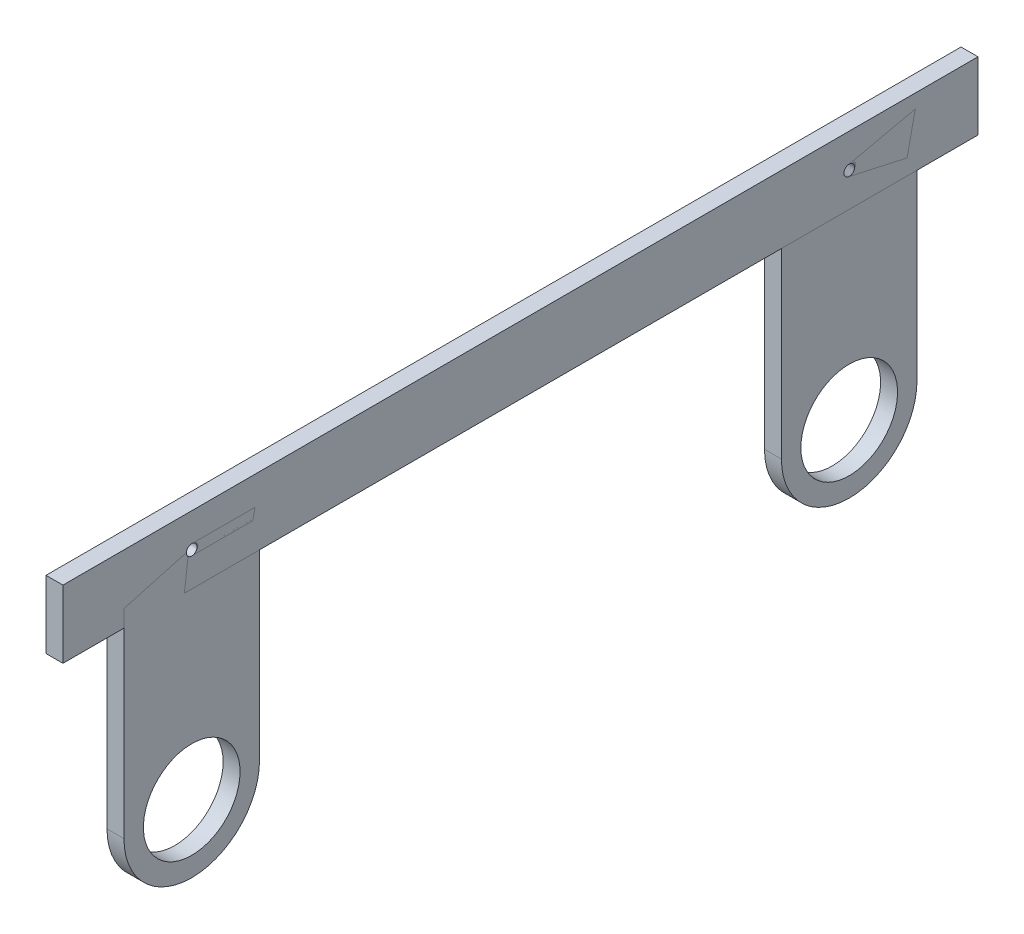
ISO-10303-21;
HEADER;
FILE_DESCRIPTION(('STEP AP214'),'2;1');
FILE_NAME('part.step','',(''),(''),'','','');
FILE_SCHEMA(('AUTOMOTIVE_DESIGN { 1 0 10303 214 1 1 1 1 }'));
ENDSEC;
DATA;
#1=APPLICATION_CONTEXT('core data for automotive mechanical design processes');
#2=APPLICATION_PROTOCOL_DEFINITION('international standard','automotive_design',2000,#1);
#3=PRODUCT_CONTEXT('',#1,'mechanical');
#4=PRODUCT('Part','Part','',(#3));
#5=PRODUCT_RELATED_PRODUCT_CATEGORY('part','',(#4));
#6=PRODUCT_DEFINITION_FORMATION('','',#4);
#7=PRODUCT_DEFINITION_CONTEXT('part definition',#1,'design');
#8=PRODUCT_DEFINITION('design','',#6,#7);
#9=PRODUCT_DEFINITION_SHAPE('','',#8);
#10=(LENGTH_UNIT() NAMED_UNIT(*) SI_UNIT(.MILLI.,.METRE.));
#11=(NAMED_UNIT(*) PLANE_ANGLE_UNIT() SI_UNIT($,.RADIAN.));
#12=(NAMED_UNIT(*) SI_UNIT($,.STERADIAN.) SOLID_ANGLE_UNIT());
#13=UNCERTAINTY_MEASURE_WITH_UNIT(LENGTH_MEASURE(1.E-05),#10,'distance_accuracy_value','');
#14=(GEOMETRIC_REPRESENTATION_CONTEXT(3) GLOBAL_UNCERTAINTY_ASSIGNED_CONTEXT((#13)) GLOBAL_UNIT_ASSIGNED_CONTEXT((#10,
#11,#12)) REPRESENTATION_CONTEXT('',''));
#15=CARTESIAN_POINT('',(0.,0.,0.));
#16=DIRECTION('',(0.,0.,1.));
#17=DIRECTION('',(1.,0.,0.));
#18=AXIS2_PLACEMENT_3D('',#15,#16,#17);
#19=CARTESIAN_POINT('',(-1.5662353927635,-64.1697161622128,97.0000000000001));
#20=DIRECTION('',(1.,0.,0.));
#21=DIRECTION('',(0.,0.,-1.));
#22=AXIS2_PLACEMENT_3D('',#19,#20,#21);
#23=PLANE('',#22);
#24=CARTESIAN_POINT('',(-1.56623539276351,-0.373605612575221,97.0000000000001));
#25=DIRECTION('',(1.,0.,0.));
#26=DIRECTION('',(0.,0.,-1.));
#27=AXIS2_PLACEMENT_3D('',#24,#25,#26);
#28=CIRCLE('',#27,1.58);
#29=CARTESIAN_POINT('',(-1.56623539276351,-0.37360561257522,95.4200000000001));
#30=VERTEX_POINT('',#29);
#31=EDGE_CURVE('P0_E85',#30,#30,#28,.T.);
#32=ORIENTED_EDGE('',*,*,#31,.F.);
#33=EDGE_LOOP('',(#32));
#34=FACE_BOUND('',#33,.T.);
#35=CARTESIAN_POINT('',(-1.5662353927635,-64.1697161622128,97.0000000000001));
#36=DIRECTION('',(1.,0.,0.));
#37=DIRECTION('',(0.,0.,-1.));
#38=AXIS2_PLACEMENT_3D('',#35,#36,#37);
#39=CIRCLE('',#38,20.);
#40=CARTESIAN_POINT('',(-1.5662353927635,-64.1697161622128,117.));
#41=VERTEX_POINT('',#40);
#42=CARTESIAN_POINT('',(-1.5662353927635,-64.1697161622128,77.0000000000001));
#43=VERTEX_POINT('',#42);
#44=EDGE_CURVE('P0_E68',#41,#43,#39,.T.);
#45=ORIENTED_EDGE('',*,*,#44,.T.);
#46=DIRECTION('',(0.,1.,0.));
#47=VECTOR('',#46,1.);
#48=CARTESIAN_POINT('',(-1.56623539276351,7.83028383778716,77.0000000000001));
#49=LINE('',#48,#47);
#50=CARTESIAN_POINT('',(-1.56623539276351,7.83028383778716,77.0000000000001));
#51=VERTEX_POINT('',#50);
#52=EDGE_CURVE('P0_E62',#43,#51,#49,.T.);
#53=ORIENTED_EDGE('',*,*,#52,.T.);
#54=DIRECTION('',(0.,0.,1.));
#55=VECTOR('',#54,1.);
#56=CARTESIAN_POINT('',(-1.56623539276351,7.83028383778716,117.));
#57=LINE('',#56,#55);
#58=CARTESIAN_POINT('',(-1.56623539276351,7.83028383778716,117.));
#59=VERTEX_POINT('',#58);
#60=EDGE_CURVE('P0_E65',#51,#59,#57,.T.);
#61=ORIENTED_EDGE('',*,*,#60,.T.);
#62=DIRECTION('',(0.,-1.,0.));
#63=VECTOR('',#62,1.);
#64=CARTESIAN_POINT('',(-1.56623539276351,7.83028383778716,117.));
#65=LINE('',#64,#63);
#66=EDGE_CURVE('P0_E34',#59,#41,#65,.T.);
#67=ORIENTED_EDGE('',*,*,#66,.T.);
#68=EDGE_LOOP('',(#45,#53,#61,#67));
#69=FACE_BOUND('',#68,.T.);
#70=CARTESIAN_POINT('',(-1.5662353927635,-64.1697161622128,97.0000000000001));
#71=DIRECTION('',(1.,0.,0.));
#72=DIRECTION('',(0.,0.,-1.));
#73=AXIS2_PLACEMENT_3D('',#70,#71,#72);
#74=CIRCLE('',#73,14.26);
#75=CARTESIAN_POINT('',(-1.5662353927635,-64.1697161622128,82.7400000000001));
#76=VERTEX_POINT('',#75);
#77=EDGE_CURVE('P0_E97',#76,#76,#74,.T.);
#78=ORIENTED_EDGE('',*,*,#77,.F.);
#79=EDGE_LOOP('',(#78));
#80=FACE_BOUND('',#79,.T.);
#81=ADVANCED_FACE('P0_F17',(#34,#69,#80),#23,.T.);
#82=CARTESIAN_POINT('',(-6.5662353927635,-64.1697161622128,97.0000000000001));
#83=DIRECTION('',(1.,0.,0.));
#84=DIRECTION('',(0.,0.,-1.));
#85=AXIS2_PLACEMENT_3D('',#82,#83,#84);
#86=PLANE('',#85);
#87=CARTESIAN_POINT('',(-6.5662353927635,-64.1697161622128,97.0000000000001));
#88=DIRECTION('',(1.,0.,0.));
#89=DIRECTION('',(0.,0.,-1.));
#90=AXIS2_PLACEMENT_3D('',#87,#88,#89);
#91=CIRCLE('',#90,20.);
#92=CARTESIAN_POINT('',(-6.5662353927635,-64.1697161622128,117.));
#93=VERTEX_POINT('',#92);
#94=CARTESIAN_POINT('',(-6.5662353927635,-64.1697161622128,77.0000000000001));
#95=VERTEX_POINT('',#94);
#96=EDGE_CURVE('P0_E82',#93,#95,#91,.T.);
#97=ORIENTED_EDGE('',*,*,#96,.F.);
#98=DIRECTION('',(0.,-1.,0.));
#99=VECTOR('',#98,1.);
#100=CARTESIAN_POINT('',(-6.5662353927635,-64.1697161622128,117.));
#101=LINE('',#100,#99);
#102=CARTESIAN_POINT('',(-6.56623539276351,7.83028383778716,117.));
#103=VERTEX_POINT('',#102);
#104=EDGE_CURVE('P0_E51',#103,#93,#101,.T.);
#105=ORIENTED_EDGE('',*,*,#104,.F.);
#106=DIRECTION('',(0.,0.,1.));
#107=VECTOR('',#106,1.);
#108=CARTESIAN_POINT('',(-6.56623539276351,7.83028383778716,117.));
#109=LINE('',#108,#107);
#110=CARTESIAN_POINT('',(-6.56623539276351,7.83028383778716,77.0000000000001));
#111=VERTEX_POINT('',#110);
#112=EDGE_CURVE('P0_E87',#111,#103,#109,.T.);
#113=ORIENTED_EDGE('',*,*,#112,.F.);
#114=DIRECTION('',(0.,1.,0.));
#115=VECTOR('',#114,1.);
#116=CARTESIAN_POINT('',(-6.56623539276351,7.83028383778716,77.0000000000001));
#117=LINE('',#116,#115);
#118=EDGE_CURVE('P0_E73',#95,#111,#117,.T.);
#119=ORIENTED_EDGE('',*,*,#118,.F.);
#120=EDGE_LOOP('',(#97,#105,#113,#119));
#121=FACE_BOUND('',#120,.T.);
#122=CARTESIAN_POINT('',(-6.56623539276351,-0.373605612575222,97.0000000000001));
#123=DIRECTION('',(1.,0.,0.));
#124=DIRECTION('',(0.,0.,-1.));
#125=AXIS2_PLACEMENT_3D('',#122,#123,#124);
#126=CIRCLE('',#125,1.58);
#127=CARTESIAN_POINT('',(-6.56623539276351,-0.373605612575222,95.4200000000001));
#128=VERTEX_POINT('',#127);
#129=EDGE_CURVE('P0_E94',#128,#128,#126,.T.);
#130=ORIENTED_EDGE('',*,*,#129,.T.);
#131=EDGE_LOOP('',(#130));
#132=FACE_BOUND('',#131,.T.);
#133=CARTESIAN_POINT('',(-6.5662353927635,-64.1697161622128,97.0000000000001));
#134=DIRECTION('',(1.,0.,0.));
#135=DIRECTION('',(0.,0.,-1.));
#136=AXIS2_PLACEMENT_3D('',#133,#134,#135);
#137=CIRCLE('',#136,14.26);
#138=CARTESIAN_POINT('',(-6.5662353927635,-64.1697161622128,82.7400000000001));
#139=VERTEX_POINT('',#138);
#140=EDGE_CURVE('P0_E100',#139,#139,#137,.T.);
#141=ORIENTED_EDGE('',*,*,#140,.T.);
#142=EDGE_LOOP('',(#141));
#143=FACE_BOUND('',#142,.T.);
#144=ADVANCED_FACE('P0_F109',(#121,#132,#143),#86,.F.);
#145=CARTESIAN_POINT('',(-1.5662353927635,-64.1697161622128,97.0000000000001));
#146=DIRECTION('',(-1.,0.,0.));
#147=DIRECTION('',(0.,0.,1.));
#148=AXIS2_PLACEMENT_3D('',#145,#146,#147);
#149=CYLINDRICAL_SURFACE('',#148,20.);
#150=ORIENTED_EDGE('',*,*,#96,.T.);
#151=DIRECTION('',(-1.,0.,0.));
#152=VECTOR('',#151,1.);
#153=CARTESIAN_POINT('',(-1.5662353927635,-64.1697161622128,77.0000000000001));
#154=LINE('',#153,#152);
#155=EDGE_CURVE('P0_E11',#43,#95,#154,.T.);
#156=ORIENTED_EDGE('',*,*,#155,.F.);
#157=ORIENTED_EDGE('',*,*,#44,.F.);
#158=DIRECTION('',(-1.,0.,0.));
#159=VECTOR('',#158,1.);
#160=CARTESIAN_POINT('',(-1.5662353927635,-64.1697161622128,117.));
#161=LINE('',#160,#159);
#162=EDGE_CURVE('P0_E78',#41,#93,#161,.T.);
#163=ORIENTED_EDGE('',*,*,#162,.T.);
#164=EDGE_LOOP('',(#150,#156,#157,#163));
#165=FACE_BOUND('',#164,.T.);
#166=ADVANCED_FACE('P0_F19',(#165),#149,.T.);
#167=CARTESIAN_POINT('',(-1.56623539276351,7.83028383778716,77.0000000000001));
#168=DIRECTION('',(0.,0.,1.));
#169=DIRECTION('',(0.,-1.,0.));
#170=AXIS2_PLACEMENT_3D('',#167,#168,#169);
#171=PLANE('',#170);
#172=ORIENTED_EDGE('',*,*,#118,.T.);
#173=DIRECTION('',(-1.,0.,0.));
#174=VECTOR('',#173,1.);
#175=CARTESIAN_POINT('',(-1.56623539276351,7.83028383778716,77.0000000000001));
#176=LINE('',#175,#174);
#177=EDGE_CURVE('P0_E26',#51,#111,#176,.T.);
#178=ORIENTED_EDGE('',*,*,#177,.F.);
#179=ORIENTED_EDGE('',*,*,#52,.F.);
#180=ORIENTED_EDGE('',*,*,#155,.T.);
#181=EDGE_LOOP('',(#172,#178,#179,#180));
#182=FACE_BOUND('',#181,.T.);
#183=ADVANCED_FACE('P0_F72',(#182),#171,.F.);
#184=CARTESIAN_POINT('',(-1.56623539276351,7.83028383778716,117.));
#185=DIRECTION('',(0.,-1.,0.));
#186=DIRECTION('',(0.,0.,-1.));
#187=AXIS2_PLACEMENT_3D('',#184,#185,#186);
#188=PLANE('',#187);
#189=ORIENTED_EDGE('',*,*,#112,.T.);
#190=DIRECTION('',(-1.,0.,0.));
#191=VECTOR('',#190,1.);
#192=CARTESIAN_POINT('',(-1.56623539276351,7.83028383778716,117.));
#193=LINE('',#192,#191);
#194=EDGE_CURVE('P0_E75',#59,#103,#193,.T.);
#195=ORIENTED_EDGE('',*,*,#194,.F.);
#196=ORIENTED_EDGE('',*,*,#60,.F.);
#197=ORIENTED_EDGE('',*,*,#177,.T.);
#198=EDGE_LOOP('',(#189,#195,#196,#197));
#199=FACE_BOUND('',#198,.T.);
#200=ADVANCED_FACE('P0_F76',(#199),#188,.F.);
#201=CARTESIAN_POINT('',(-1.5662353927635,-64.1697161622128,117.));
#202=DIRECTION('',(0.,0.,-1.));
#203=DIRECTION('',(0.,1.,0.));
#204=AXIS2_PLACEMENT_3D('',#201,#202,#203);
#205=PLANE('',#204);
#206=ORIENTED_EDGE('',*,*,#104,.T.);
#207=ORIENTED_EDGE('',*,*,#162,.F.);
#208=ORIENTED_EDGE('',*,*,#66,.F.);
#209=ORIENTED_EDGE('',*,*,#194,.T.);
#210=EDGE_LOOP('',(#206,#207,#208,#209));
#211=FACE_BOUND('',#210,.T.);
#212=ADVANCED_FACE('P0_F91',(#211),#205,.F.);
#213=CARTESIAN_POINT('',(-1.56623539276351,-0.373605612575221,97.0000000000001));
#214=DIRECTION('',(-1.,0.,0.));
#215=DIRECTION('',(0.,0.,1.));
#216=AXIS2_PLACEMENT_3D('',#213,#214,#215);
#217=CYLINDRICAL_SURFACE('',#216,1.58);
#218=ORIENTED_EDGE('',*,*,#31,.T.);
#219=EDGE_LOOP('',(#218));
#220=FACE_BOUND('',#219,.T.);
#221=ORIENTED_EDGE('',*,*,#129,.F.);
#222=EDGE_LOOP('',(#221));
#223=FACE_BOUND('',#222,.T.);
#224=ADVANCED_FACE('P0_F119',(#220,#223),#217,.F.);
#225=CARTESIAN_POINT('',(-1.5662353927635,-64.1697161622128,97.0000000000001));
#226=DIRECTION('',(-1.,0.,0.));
#227=DIRECTION('',(0.,0.,1.));
#228=AXIS2_PLACEMENT_3D('',#225,#226,#227);
#229=CYLINDRICAL_SURFACE('',#228,14.26);
#230=ORIENTED_EDGE('',*,*,#77,.T.);
#231=EDGE_LOOP('',(#230));
#232=FACE_BOUND('',#231,.T.);
#233=ORIENTED_EDGE('',*,*,#140,.F.);
#234=EDGE_LOOP('',(#233));
#235=FACE_BOUND('',#234,.T.);
#236=ADVANCED_FACE('P0_F106',(#232,#235),#229,.F.);
#237=CLOSED_SHELL('',(#81,#144,#166,#183,#200,#212,#224,#236));
#238=MANIFOLD_SOLID_BREP('P0_B1',#237);
#239=CARTESIAN_POINT('',(-6.56623539276349,-64.1697161622128,-96.9999999999999));
#240=DIRECTION('',(-1.,0.,0.));
#241=DIRECTION('',(0.,0.,1.));
#242=AXIS2_PLACEMENT_3D('',#239,#240,#241);
#243=PLANE('',#242);
#244=CARTESIAN_POINT('',(-6.56623539276349,-0.373605612575219,-96.9999999999999));
#245=DIRECTION('',(-1.,0.,0.));
#246=DIRECTION('',(0.,0.,1.));
#247=AXIS2_PLACEMENT_3D('',#244,#245,#246);
#248=CIRCLE('',#247,1.58);
#249=CARTESIAN_POINT('',(-6.56623539276349,-0.373605612575219,-95.4199999999999));
#250=VERTEX_POINT('',#249);
#251=EDGE_CURVE('P1_E84',#250,#250,#248,.T.);
#252=ORIENTED_EDGE('',*,*,#251,.F.);
#253=EDGE_LOOP('',(#252));
#254=FACE_BOUND('',#253,.T.);
#255=CARTESIAN_POINT('',(-6.56623539276349,-64.1697161622128,-96.9999999999999));
#256=DIRECTION('',(-1.,0.,0.));
#257=DIRECTION('',(0.,0.,1.));
#258=AXIS2_PLACEMENT_3D('',#255,#256,#257);
#259=CIRCLE('',#258,20.);
#260=CARTESIAN_POINT('',(-6.56623539276349,-64.1697161622128,-117.));
#261=VERTEX_POINT('',#260);
#262=CARTESIAN_POINT('',(-6.56623539276349,-64.1697161622128,-77.));
#263=VERTEX_POINT('',#262);
#264=EDGE_CURVE('P1_E67',#261,#263,#259,.T.);
#265=ORIENTED_EDGE('',*,*,#264,.T.);
#266=DIRECTION('',(0.,1.,0.));
#267=VECTOR('',#266,1.);
#268=CARTESIAN_POINT('',(-6.56623539276348,7.83028383778717,-77.));
#269=LINE('',#268,#267);
#270=CARTESIAN_POINT('',(-6.56623539276348,7.83028383778717,-77.));
#271=VERTEX_POINT('',#270);
#272=EDGE_CURVE('P1_E61',#263,#271,#269,.T.);
#273=ORIENTED_EDGE('',*,*,#272,.T.);
#274=DIRECTION('',(0.,0.,-1.));
#275=VECTOR('',#274,1.);
#276=CARTESIAN_POINT('',(-6.56623539276349,7.83028383778716,-117.));
#277=LINE('',#276,#275);
#278=CARTESIAN_POINT('',(-6.56623539276349,7.83028383778716,-117.));
#279=VERTEX_POINT('',#278);
#280=EDGE_CURVE('P1_E64',#271,#279,#277,.T.);
#281=ORIENTED_EDGE('',*,*,#280,.T.);
#282=DIRECTION('',(0.,-1.,0.));
#283=VECTOR('',#282,1.);
#284=CARTESIAN_POINT('',(-6.56623539276349,7.83028383778716,-117.));
#285=LINE('',#284,#283);
#286=EDGE_CURVE('P1_E33',#279,#261,#285,.T.);
#287=ORIENTED_EDGE('',*,*,#286,.T.);
#288=EDGE_LOOP('',(#265,#273,#281,#287));
#289=FACE_BOUND('',#288,.T.);
#290=CARTESIAN_POINT('',(-6.56623539276349,-64.1697161622128,-96.9999999999999));
#291=DIRECTION('',(-1.,0.,0.));
#292=DIRECTION('',(0.,0.,1.));
#293=AXIS2_PLACEMENT_3D('',#290,#291,#292);
#294=CIRCLE('',#293,14.26);
#295=CARTESIAN_POINT('',(-6.56623539276349,-64.1697161622128,-82.74));
#296=VERTEX_POINT('',#295);
#297=EDGE_CURVE('P1_E96',#296,#296,#294,.T.);
#298=ORIENTED_EDGE('',*,*,#297,.F.);
#299=EDGE_LOOP('',(#298));
#300=FACE_BOUND('',#299,.T.);
#301=ADVANCED_FACE('P1_F16',(#254,#289,#300),#243,.T.);
#302=CARTESIAN_POINT('',(-1.56623539276349,-64.1697161622128,-96.9999999999999));
#303=DIRECTION('',(-1.,0.,0.));
#304=DIRECTION('',(0.,0.,1.));
#305=AXIS2_PLACEMENT_3D('',#302,#303,#304);
#306=PLANE('',#305);
#307=CARTESIAN_POINT('',(-1.56623539276349,-64.1697161622128,-96.9999999999999));
#308=DIRECTION('',(-1.,0.,0.));
#309=DIRECTION('',(0.,0.,1.));
#310=AXIS2_PLACEMENT_3D('',#307,#308,#309);
#311=CIRCLE('',#310,20.);
#312=CARTESIAN_POINT('',(-1.56623539276349,-64.1697161622128,-117.));
#313=VERTEX_POINT('',#312);
#314=CARTESIAN_POINT('',(-1.56623539276349,-64.1697161622128,-77.));
#315=VERTEX_POINT('',#314);
#316=EDGE_CURVE('P1_E81',#313,#315,#311,.T.);
#317=ORIENTED_EDGE('',*,*,#316,.F.);
#318=DIRECTION('',(0.,-1.,0.));
#319=VECTOR('',#318,1.);
#320=CARTESIAN_POINT('',(-1.56623539276349,-64.1697161622128,-117.));
#321=LINE('',#320,#319);
#322=CARTESIAN_POINT('',(-1.56623539276349,7.83028383778716,-117.));
#323=VERTEX_POINT('',#322);
#324=EDGE_CURVE('P1_E50',#323,#313,#321,.T.);
#325=ORIENTED_EDGE('',*,*,#324,.F.);
#326=DIRECTION('',(0.,0.,-1.));
#327=VECTOR('',#326,1.);
#328=CARTESIAN_POINT('',(-1.56623539276349,7.83028383778716,-117.));
#329=LINE('',#328,#327);
#330=CARTESIAN_POINT('',(-1.56623539276348,7.83028383778717,-77.));
#331=VERTEX_POINT('',#330);
#332=EDGE_CURVE('P1_E86',#331,#323,#329,.T.);
#333=ORIENTED_EDGE('',*,*,#332,.F.);
#334=DIRECTION('',(0.,1.,0.));
#335=VECTOR('',#334,1.);
#336=CARTESIAN_POINT('',(-1.56623539276348,7.83028383778717,-77.));
#337=LINE('',#336,#335);
#338=EDGE_CURVE('P1_E72',#315,#331,#337,.T.);
#339=ORIENTED_EDGE('',*,*,#338,.F.);
#340=EDGE_LOOP('',(#317,#325,#333,#339));
#341=FACE_BOUND('',#340,.T.);
#342=CARTESIAN_POINT('',(-1.56623539276349,-0.373605612575219,-96.9999999999999));
#343=DIRECTION('',(-1.,0.,0.));
#344=DIRECTION('',(0.,0.,1.));
#345=AXIS2_PLACEMENT_3D('',#342,#343,#344);
#346=CIRCLE('',#345,1.58);
#347=CARTESIAN_POINT('',(-1.56623539276349,-0.373605612575219,-95.4199999999999));
#348=VERTEX_POINT('',#347);
#349=EDGE_CURVE('P1_E93',#348,#348,#346,.T.);
#350=ORIENTED_EDGE('',*,*,#349,.T.);
#351=EDGE_LOOP('',(#350));
#352=FACE_BOUND('',#351,.T.);
#353=CARTESIAN_POINT('',(-1.56623539276349,-64.1697161622128,-96.9999999999999));
#354=DIRECTION('',(-1.,0.,0.));
#355=DIRECTION('',(0.,0.,1.));
#356=AXIS2_PLACEMENT_3D('',#353,#354,#355);
#357=CIRCLE('',#356,14.26);
#358=CARTESIAN_POINT('',(-1.56623539276349,-64.1697161622128,-82.74));
#359=VERTEX_POINT('',#358);
#360=EDGE_CURVE('P1_E99',#359,#359,#357,.T.);
#361=ORIENTED_EDGE('',*,*,#360,.T.);
#362=EDGE_LOOP('',(#361));
#363=FACE_BOUND('',#362,.T.);
#364=ADVANCED_FACE('P1_F108',(#341,#352,#363),#306,.F.);
#365=CARTESIAN_POINT('',(-6.56623539276349,-64.1697161622128,-96.9999999999999));
#366=DIRECTION('',(1.,0.,0.));
#367=DIRECTION('',(0.,0.,-1.));
#368=AXIS2_PLACEMENT_3D('',#365,#366,#367);
#369=CYLINDRICAL_SURFACE('',#368,20.);
#370=ORIENTED_EDGE('',*,*,#316,.T.);
#371=DIRECTION('',(1.,0.,0.));
#372=VECTOR('',#371,1.);
#373=CARTESIAN_POINT('',(-6.56623539276349,-64.1697161622128,-77.));
#374=LINE('',#373,#372);
#375=EDGE_CURVE('P1_E10',#263,#315,#374,.T.);
#376=ORIENTED_EDGE('',*,*,#375,.F.);
#377=ORIENTED_EDGE('',*,*,#264,.F.);
#378=DIRECTION('',(1.,0.,0.));
#379=VECTOR('',#378,1.);
#380=CARTESIAN_POINT('',(-6.56623539276349,-64.1697161622128,-117.));
#381=LINE('',#380,#379);
#382=EDGE_CURVE('P1_E77',#261,#313,#381,.T.);
#383=ORIENTED_EDGE('',*,*,#382,.T.);
#384=EDGE_LOOP('',(#370,#376,#377,#383));
#385=FACE_BOUND('',#384,.T.);
#386=ADVANCED_FACE('P1_F18',(#385),#369,.T.);
#387=CARTESIAN_POINT('',(-6.56623539276348,7.83028383778717,-77.));
#388=DIRECTION('',(0.,0.,-1.));
#389=DIRECTION('',(0.,-1.,0.));
#390=AXIS2_PLACEMENT_3D('',#387,#388,#389);
#391=PLANE('',#390);
#392=ORIENTED_EDGE('',*,*,#338,.T.);
#393=DIRECTION('',(1.,0.,0.));
#394=VECTOR('',#393,1.);
#395=CARTESIAN_POINT('',(-6.56623539276348,7.83028383778717,-77.));
#396=LINE('',#395,#394);
#397=EDGE_CURVE('P1_E25',#271,#331,#396,.T.);
#398=ORIENTED_EDGE('',*,*,#397,.F.);
#399=ORIENTED_EDGE('',*,*,#272,.F.);
#400=ORIENTED_EDGE('',*,*,#375,.T.);
#401=EDGE_LOOP('',(#392,#398,#399,#400));
#402=FACE_BOUND('',#401,.T.);
#403=ADVANCED_FACE('P1_F71',(#402),#391,.F.);
#404=CARTESIAN_POINT('',(-6.56623539276349,7.83028383778716,-117.));
#405=DIRECTION('',(0.,-1.,0.));
#406=DIRECTION('',(0.,0.,1.));
#407=AXIS2_PLACEMENT_3D('',#404,#405,#406);
#408=PLANE('',#407);
#409=ORIENTED_EDGE('',*,*,#332,.T.);
#410=DIRECTION('',(1.,0.,0.));
#411=VECTOR('',#410,1.);
#412=CARTESIAN_POINT('',(-6.56623539276349,7.83028383778716,-117.));
#413=LINE('',#412,#411);
#414=EDGE_CURVE('P1_E74',#279,#323,#413,.T.);
#415=ORIENTED_EDGE('',*,*,#414,.F.);
#416=ORIENTED_EDGE('',*,*,#280,.F.);
#417=ORIENTED_EDGE('',*,*,#397,.T.);
#418=EDGE_LOOP('',(#409,#415,#416,#417));
#419=FACE_BOUND('',#418,.T.);
#420=ADVANCED_FACE('P1_F75',(#419),#408,.F.);
#421=CARTESIAN_POINT('',(-6.56623539276349,-64.1697161622128,-117.));
#422=DIRECTION('',(0.,0.,1.));
#423=DIRECTION('',(0.,1.,0.));
#424=AXIS2_PLACEMENT_3D('',#421,#422,#423);
#425=PLANE('',#424);
#426=ORIENTED_EDGE('',*,*,#324,.T.);
#427=ORIENTED_EDGE('',*,*,#382,.F.);
#428=ORIENTED_EDGE('',*,*,#286,.F.);
#429=ORIENTED_EDGE('',*,*,#414,.T.);
#430=EDGE_LOOP('',(#426,#427,#428,#429));
#431=FACE_BOUND('',#430,.T.);
#432=ADVANCED_FACE('P1_F90',(#431),#425,.F.);
#433=CARTESIAN_POINT('',(-6.56623539276349,-0.373605612575219,-96.9999999999999));
#434=DIRECTION('',(1.,0.,0.));
#435=DIRECTION('',(0.,0.,-1.));
#436=AXIS2_PLACEMENT_3D('',#433,#434,#435);
#437=CYLINDRICAL_SURFACE('',#436,1.58);
#438=ORIENTED_EDGE('',*,*,#251,.T.);
#439=EDGE_LOOP('',(#438));
#440=FACE_BOUND('',#439,.T.);
#441=ORIENTED_EDGE('',*,*,#349,.F.);
#442=EDGE_LOOP('',(#441));
#443=FACE_BOUND('',#442,.T.);
#444=ADVANCED_FACE('P1_F118',(#440,#443),#437,.F.);
#445=CARTESIAN_POINT('',(-6.56623539276349,-64.1697161622128,-96.9999999999999));
#446=DIRECTION('',(1.,0.,0.));
#447=DIRECTION('',(0.,0.,-1.));
#448=AXIS2_PLACEMENT_3D('',#445,#446,#447);
#449=CYLINDRICAL_SURFACE('',#448,14.26);
#450=ORIENTED_EDGE('',*,*,#297,.T.);
#451=EDGE_LOOP('',(#450));
#452=FACE_BOUND('',#451,.T.);
#453=ORIENTED_EDGE('',*,*,#360,.F.);
#454=EDGE_LOOP('',(#453));
#455=FACE_BOUND('',#454,.T.);
#456=ADVANCED_FACE('P1_F105',(#452,#455),#449,.F.);
#457=CLOSED_SHELL('',(#301,#364,#386,#403,#420,#432,#444,#456));
#458=MANIFOLD_SOLID_BREP('P1_B1',#457);
#459=CARTESIAN_POINT('',(-1.56623539276351,-0.373605612575224,0.));
#460=DIRECTION('',(-1.,0.,0.));
#461=DIRECTION('',(0.,0.,1.));
#462=AXIS2_PLACEMENT_3D('',#459,#460,#461);
#463=PLANE('',#462);
#464=DIRECTION('',(0.,1.,0.));
#465=VECTOR('',#464,1.);
#466=CARTESIAN_POINT('',(-1.56623539276351,-10.3736056125752,-135.));
#467=LINE('',#466,#465);
#468=CARTESIAN_POINT('',(-1.56623539276351,-10.3736056125752,-135.));
#469=VERTEX_POINT('',#468);
#470=CARTESIAN_POINT('',(-1.56623539276351,9.62639438742478,-135.));
#471=VERTEX_POINT('',#470);
#472=EDGE_CURVE('P2_E69',#469,#471,#467,.T.);
#473=ORIENTED_EDGE('',*,*,#472,.T.);
#474=DIRECTION('',(0.,0.,1.));
#475=VECTOR('',#474,1.);
#476=CARTESIAN_POINT('',(-1.56623539276351,9.62639438742478,135.));
#477=LINE('',#476,#475);
#478=CARTESIAN_POINT('',(-1.56623539276351,9.62639438742478,135.));
#479=VERTEX_POINT('',#478);
#480=EDGE_CURVE('P2_E64',#471,#479,#477,.T.);
#481=ORIENTED_EDGE('',*,*,#480,.T.);
#482=DIRECTION('',(0.,-1.,0.));
#483=VECTOR('',#482,1.);
#484=CARTESIAN_POINT('',(-1.56623539276351,-10.3736056125752,135.));
#485=LINE('',#484,#483);
#486=CARTESIAN_POINT('',(-1.56623539276351,-10.3736056125752,135.));
#487=VERTEX_POINT('',#486);
#488=EDGE_CURVE('P2_E67',#479,#487,#485,.T.);
#489=ORIENTED_EDGE('',*,*,#488,.T.);
#490=DIRECTION('',(0.,0.,-1.));
#491=VECTOR('',#490,1.);
#492=CARTESIAN_POINT('',(-1.56623539276351,-10.3736056125752,135.));
#493=LINE('',#492,#491);
#494=EDGE_CURVE('P2_E34',#487,#469,#493,.T.);
#495=ORIENTED_EDGE('',*,*,#494,.T.);
#496=EDGE_LOOP('',(#473,#481,#489,#495));
#497=FACE_BOUND('',#496,.T.);
#498=CARTESIAN_POINT('',(-1.56623539276351,-0.373605612575224,-96.9999999999999));
#499=DIRECTION('',(1.,0.,0.));
#500=DIRECTION('',(0.,0.,-1.));
#501=AXIS2_PLACEMENT_3D('',#498,#499,#500);
#502=CIRCLE('',#501,1.58);
#503=CARTESIAN_POINT('',(-1.56623539276351,-0.373605612575224,-98.5799999999999));
#504=VERTEX_POINT('',#503);
#505=EDGE_CURVE('P2_E84',#504,#504,#502,.T.);
#506=ORIENTED_EDGE('',*,*,#505,.F.);
#507=EDGE_LOOP('',(#506));
#508=FACE_BOUND('',#507,.T.);
#509=CARTESIAN_POINT('',(-1.56623539276351,-0.373605612575224,97.0000000000001));
#510=DIRECTION('',(1.,0.,0.));
#511=DIRECTION('',(0.,0.,-1.));
#512=AXIS2_PLACEMENT_3D('',#509,#510,#511);
#513=CIRCLE('',#512,1.58);
#514=CARTESIAN_POINT('',(-1.56623539276351,-0.373605612575224,95.4200000000001));
#515=VERTEX_POINT('',#514);
#516=EDGE_CURVE('P2_E99',#515,#515,#513,.T.);
#517=ORIENTED_EDGE('',*,*,#516,.F.);
#518=EDGE_LOOP('',(#517));
#519=FACE_BOUND('',#518,.T.);
#520=ADVANCED_FACE('P2_F17',(#497,#508,#519),#463,.F.);
#521=CARTESIAN_POINT('',(-6.56623539276351,-0.373605612575224,0.));
#522=DIRECTION('',(-1.,0.,0.));
#523=DIRECTION('',(0.,0.,1.));
#524=AXIS2_PLACEMENT_3D('',#521,#522,#523);
#525=PLANE('',#524);
#526=CARTESIAN_POINT('',(-6.56623539276351,-0.373605612575224,-96.9999999999999));
#527=DIRECTION('',(1.,0.,0.));
#528=DIRECTION('',(0.,0.,-1.));
#529=AXIS2_PLACEMENT_3D('',#526,#527,#528);
#530=CIRCLE('',#529,1.58);
#531=CARTESIAN_POINT('',(-6.56623539276351,-0.373605612575224,-98.5799999999999));
#532=VERTEX_POINT('',#531);
#533=EDGE_CURVE('P2_E96',#532,#532,#530,.T.);
#534=ORIENTED_EDGE('',*,*,#533,.T.);
#535=EDGE_LOOP('',(#534));
#536=FACE_BOUND('',#535,.T.);
#537=DIRECTION('',(0.,1.,0.));
#538=VECTOR('',#537,1.);
#539=CARTESIAN_POINT('',(-6.56623539276351,-10.3736056125752,-135.));
#540=LINE('',#539,#538);
#541=CARTESIAN_POINT('',(-6.56623539276351,-10.3736056125752,-135.));
#542=VERTEX_POINT('',#541);
#543=CARTESIAN_POINT('',(-6.56623539276351,9.62639438742478,-135.));
#544=VERTEX_POINT('',#543);
#545=EDGE_CURVE('P2_E81',#542,#544,#540,.T.);
#546=ORIENTED_EDGE('',*,*,#545,.F.);
#547=DIRECTION('',(0.,0.,-1.));
#548=VECTOR('',#547,1.);
#549=CARTESIAN_POINT('',(-6.56623539276351,-10.3736056125752,135.));
#550=LINE('',#549,#548);
#551=CARTESIAN_POINT('',(-6.56623539276351,-10.3736056125752,135.));
#552=VERTEX_POINT('',#551);
#553=EDGE_CURVE('P2_E57',#552,#542,#550,.T.);
#554=ORIENTED_EDGE('',*,*,#553,.F.);
#555=DIRECTION('',(0.,-1.,0.));
#556=VECTOR('',#555,1.);
#557=CARTESIAN_POINT('',(-6.56623539276351,-10.3736056125752,135.));
#558=LINE('',#557,#556);
#559=CARTESIAN_POINT('',(-6.56623539276351,9.62639438742478,135.));
#560=VERTEX_POINT('',#559);
#561=EDGE_CURVE('P2_E51',#560,#552,#558,.T.);
#562=ORIENTED_EDGE('',*,*,#561,.F.);
#563=DIRECTION('',(0.,0.,1.));
#564=VECTOR('',#563,1.);
#565=CARTESIAN_POINT('',(-6.56623539276351,9.62639438742478,135.));
#566=LINE('',#565,#564);
#567=EDGE_CURVE('P2_E73',#544,#560,#566,.T.);
#568=ORIENTED_EDGE('',*,*,#567,.F.);
#569=EDGE_LOOP('',(#546,#554,#562,#568));
#570=FACE_BOUND('',#569,.T.);
#571=CARTESIAN_POINT('',(-6.56623539276351,-0.373605612575224,97.0000000000001));
#572=DIRECTION('',(1.,0.,0.));
#573=DIRECTION('',(0.,0.,-1.));
#574=AXIS2_PLACEMENT_3D('',#571,#572,#573);
#575=CIRCLE('',#574,1.58);
#576=CARTESIAN_POINT('',(-6.56623539276351,-0.373605612575224,95.4200000000001));
#577=VERTEX_POINT('',#576);
#578=EDGE_CURVE('P2_E102',#577,#577,#575,.T.);
#579=ORIENTED_EDGE('',*,*,#578,.T.);
#580=EDGE_LOOP('',(#579));
#581=FACE_BOUND('',#580,.T.);
#582=ADVANCED_FACE('P2_F92',(#536,#570,#581),#525,.T.);
#583=CARTESIAN_POINT('',(-1.56623539276351,-10.3736056125752,-135.));
#584=DIRECTION('',(0.,0.,1.));
#585=DIRECTION('',(1.,0.,0.));
#586=AXIS2_PLACEMENT_3D('',#583,#584,#585);
#587=PLANE('',#586);
#588=ORIENTED_EDGE('',*,*,#545,.T.);
#589=DIRECTION('',(-1.,0.,0.));
#590=VECTOR('',#589,1.);
#591=CARTESIAN_POINT('',(-1.56623539276351,9.62639438742478,-135.));
#592=LINE('',#591,#590);
#593=EDGE_CURVE('P2_E11',#471,#544,#592,.T.);
#594=ORIENTED_EDGE('',*,*,#593,.F.);
#595=ORIENTED_EDGE('',*,*,#472,.F.);
#596=DIRECTION('',(-1.,0.,0.));
#597=VECTOR('',#596,1.);
#598=CARTESIAN_POINT('',(-1.56623539276351,-10.3736056125752,-135.));
#599=LINE('',#598,#597);
#600=EDGE_CURVE('P2_E77',#469,#542,#599,.T.);
#601=ORIENTED_EDGE('',*,*,#600,.T.);
#602=EDGE_LOOP('',(#588,#594,#595,#601));
#603=FACE_BOUND('',#602,.T.);
#604=ADVANCED_FACE('P2_F19',(#603),#587,.F.);
#605=CARTESIAN_POINT('',(-1.56623539276351,9.62639438742478,135.));
#606=DIRECTION('',(0.,-1.,0.));
#607=DIRECTION('',(0.,0.,-1.));
#608=AXIS2_PLACEMENT_3D('',#605,#606,#607);
#609=PLANE('',#608);
#610=ORIENTED_EDGE('',*,*,#567,.T.);
#611=DIRECTION('',(-1.,0.,0.));
#612=VECTOR('',#611,1.);
#613=CARTESIAN_POINT('',(-1.56623539276351,9.62639438742478,135.));
#614=LINE('',#613,#612);
#615=EDGE_CURVE('P2_E26',#479,#560,#614,.T.);
#616=ORIENTED_EDGE('',*,*,#615,.F.);
#617=ORIENTED_EDGE('',*,*,#480,.F.);
#618=ORIENTED_EDGE('',*,*,#593,.T.);
#619=EDGE_LOOP('',(#610,#616,#617,#618));
#620=FACE_BOUND('',#619,.T.);
#621=ADVANCED_FACE('P2_F72',(#620),#609,.F.);
#622=CARTESIAN_POINT('',(-1.56623539276351,-10.3736056125752,135.));
#623=DIRECTION('',(0.,0.,-1.));
#624=DIRECTION('',(-1.,0.,0.));
#625=AXIS2_PLACEMENT_3D('',#622,#623,#624);
#626=PLANE('',#625);
#627=ORIENTED_EDGE('',*,*,#561,.T.);
#628=DIRECTION('',(-1.,0.,0.));
#629=VECTOR('',#628,1.);
#630=CARTESIAN_POINT('',(-1.56623539276351,-10.3736056125752,135.));
#631=LINE('',#630,#629);
#632=EDGE_CURVE('P2_E74',#487,#552,#631,.T.);
#633=ORIENTED_EDGE('',*,*,#632,.F.);
#634=ORIENTED_EDGE('',*,*,#488,.F.);
#635=ORIENTED_EDGE('',*,*,#615,.T.);
#636=EDGE_LOOP('',(#627,#633,#634,#635));
#637=FACE_BOUND('',#636,.T.);
#638=ADVANCED_FACE('P2_F75',(#637),#626,.F.);
#639=CARTESIAN_POINT('',(-1.56623539276351,-10.3736056125752,135.));
#640=DIRECTION('',(0.,1.,0.));
#641=DIRECTION('',(0.,0.,1.));
#642=AXIS2_PLACEMENT_3D('',#639,#640,#641);
#643=PLANE('',#642);
#644=ORIENTED_EDGE('',*,*,#553,.T.);
#645=ORIENTED_EDGE('',*,*,#600,.F.);
#646=ORIENTED_EDGE('',*,*,#494,.F.);
#647=ORIENTED_EDGE('',*,*,#632,.T.);
#648=EDGE_LOOP('',(#644,#645,#646,#647));
#649=FACE_BOUND('',#648,.T.);
#650=ADVANCED_FACE('P2_F89',(#649),#643,.F.);
#651=CARTESIAN_POINT('',(-1.56623539276351,-0.373605612575224,-96.9999999999999));
#652=DIRECTION('',(-1.,0.,0.));
#653=DIRECTION('',(0.,0.,1.));
#654=AXIS2_PLACEMENT_3D('',#651,#652,#653);
#655=CYLINDRICAL_SURFACE('',#654,1.58);
#656=ORIENTED_EDGE('',*,*,#505,.T.);
#657=EDGE_LOOP('',(#656));
#658=FACE_BOUND('',#657,.T.);
#659=ORIENTED_EDGE('',*,*,#533,.F.);
#660=EDGE_LOOP('',(#659));
#661=FACE_BOUND('',#660,.T.);
#662=ADVANCED_FACE('P2_F120',(#658,#661),#655,.F.);
#663=CARTESIAN_POINT('',(-1.56623539276351,-0.373605612575224,97.0000000000001));
#664=DIRECTION('',(-1.,0.,0.));
#665=DIRECTION('',(0.,0.,1.));
#666=AXIS2_PLACEMENT_3D('',#663,#664,#665);
#667=CYLINDRICAL_SURFACE('',#666,1.58);
#668=ORIENTED_EDGE('',*,*,#516,.T.);
#669=EDGE_LOOP('',(#668));
#670=FACE_BOUND('',#669,.T.);
#671=ORIENTED_EDGE('',*,*,#578,.F.);
#672=EDGE_LOOP('',(#671));
#673=FACE_BOUND('',#672,.T.);
#674=ADVANCED_FACE('P2_F108',(#670,#673),#667,.F.);
#675=CLOSED_SHELL('',(#520,#582,#604,#621,#638,#650,#662,#674));
#676=MANIFOLD_SOLID_BREP('P2_B1',#675);
#677=ADVANCED_BREP_SHAPE_REPRESENTATION('',(#18,#238,#458,#676),#14);
#678=SHAPE_DEFINITION_REPRESENTATION(#9,#677);
ENDSEC;
END-ISO-10303-21;
